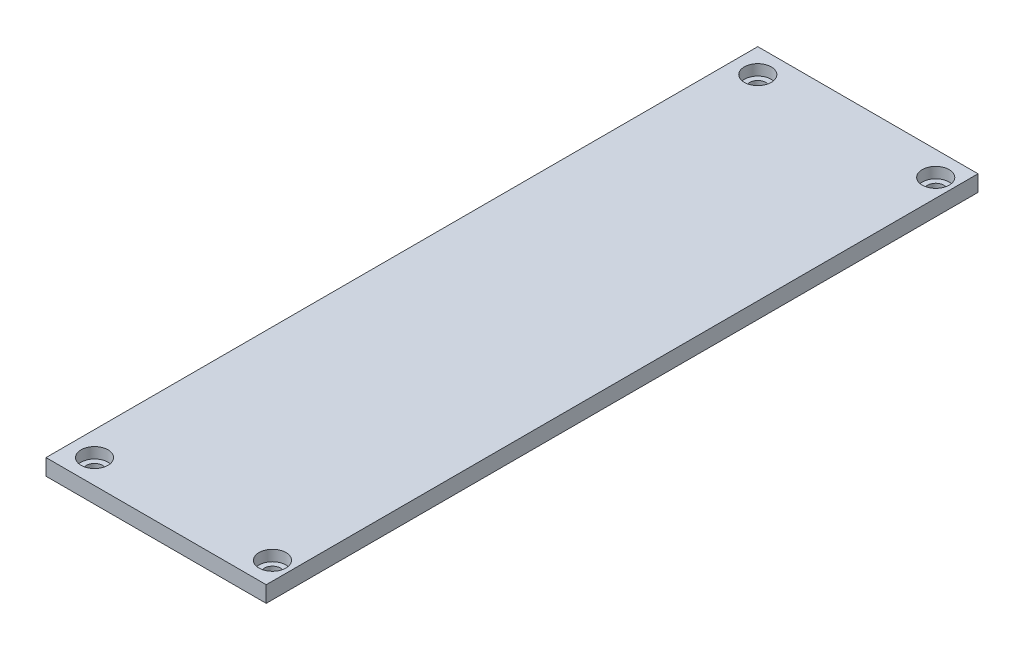
ISO-10303-21;
HEADER;
FILE_DESCRIPTION(('STEP AP214'),'2;1');
FILE_NAME('part.step','',(''),(''),'','','');
FILE_SCHEMA(('AUTOMOTIVE_DESIGN { 1 0 10303 214 1 1 1 1 }'));
ENDSEC;
DATA;
#1=APPLICATION_CONTEXT('core data for automotive mechanical design processes');
#2=APPLICATION_PROTOCOL_DEFINITION('international standard','automotive_design',2000,#1);
#3=PRODUCT_CONTEXT('',#1,'mechanical');
#4=PRODUCT('Part','Part','',(#3));
#5=PRODUCT_RELATED_PRODUCT_CATEGORY('part','',(#4));
#6=PRODUCT_DEFINITION_FORMATION('','',#4);
#7=PRODUCT_DEFINITION_CONTEXT('part definition',#1,'design');
#8=PRODUCT_DEFINITION('design','',#6,#7);
#9=PRODUCT_DEFINITION_SHAPE('','',#8);
#10=(LENGTH_UNIT() NAMED_UNIT(*) SI_UNIT(.MILLI.,.METRE.));
#11=(NAMED_UNIT(*) PLANE_ANGLE_UNIT() SI_UNIT($,.RADIAN.));
#12=(NAMED_UNIT(*) SI_UNIT($,.STERADIAN.) SOLID_ANGLE_UNIT());
#13=UNCERTAINTY_MEASURE_WITH_UNIT(LENGTH_MEASURE(1.E-05),#10,'distance_accuracy_value','');
#14=(GEOMETRIC_REPRESENTATION_CONTEXT(3) GLOBAL_UNCERTAINTY_ASSIGNED_CONTEXT((#13)) GLOBAL_UNIT_ASSIGNED_CONTEXT((#10,
#11,#12)) REPRESENTATION_CONTEXT('',''));
#15=CARTESIAN_POINT('',(0.,0.,0.));
#16=DIRECTION('',(0.,0.,1.));
#17=DIRECTION('',(1.,0.,0.));
#18=AXIS2_PLACEMENT_3D('',#15,#16,#17);
#19=CARTESIAN_POINT('',(-21.,3.,66.));
#20=DIRECTION('',(0.,0.,-1.));
#21=DIRECTION('',(-1.,0.,0.));
#22=AXIS2_PLACEMENT_3D('',#19,#20,#21);
#23=PLANE('',#22);
#24=DIRECTION('',(0.,-1.,0.));
#25=VECTOR('',#24,1.);
#26=CARTESIAN_POINT('',(19.8402403403684,3.,66.));
#27=LINE('',#26,#25);
#28=CARTESIAN_POINT('',(19.8402403403684,3.,66.));
#29=VERTEX_POINT('',#28);
#30=CARTESIAN_POINT('',(19.8402403403684,0.,66.));
#31=VERTEX_POINT('',#30);
#32=EDGE_CURVE('E55',#29,#31,#27,.T.);
#33=ORIENTED_EDGE('',*,*,#32,.F.);
#34=DIRECTION('',(1.,0.,0.));
#35=VECTOR('',#34,1.);
#36=CARTESIAN_POINT('',(-21.,3.,66.));
#37=LINE('',#36,#35);
#38=CARTESIAN_POINT('',(-21.,3.,66.));
#39=VERTEX_POINT('',#38);
#40=EDGE_CURVE('E152',#39,#29,#37,.T.);
#41=ORIENTED_EDGE('',*,*,#40,.F.);
#42=DIRECTION('',(0.,-1.,0.));
#43=VECTOR('',#42,1.);
#44=CARTESIAN_POINT('',(-21.,3.,66.));
#45=LINE('',#44,#43);
#46=CARTESIAN_POINT('',(-21.,0.,66.));
#47=VERTEX_POINT('',#46);
#48=EDGE_CURVE('E153',#39,#47,#45,.T.);
#49=ORIENTED_EDGE('',*,*,#48,.T.);
#50=DIRECTION('',(1.,0.,0.));
#51=VECTOR('',#50,1.);
#52=CARTESIAN_POINT('',(-21.,0.,66.));
#53=LINE('',#52,#51);
#54=EDGE_CURVE('E150',#47,#31,#53,.T.);
#55=ORIENTED_EDGE('',*,*,#54,.T.);
#56=EDGE_LOOP('',(#33,#41,#49,#55));
#57=FACE_BOUND('',#56,.T.);
#58=ADVANCED_FACE('F40',(#57),#23,.F.);
#59=CARTESIAN_POINT('',(0.,3.,0.));
#60=DIRECTION('',(0.,1.,0.));
#61=DIRECTION('',(0.,0.,1.));
#62=AXIS2_PLACEMENT_3D('',#59,#60,#61);
#63=PLANE('',#62);
#64=CARTESIAN_POINT('',(-16.5,3.,61.5));
#65=DIRECTION('',(0.,1.,0.));
#66=DIRECTION('',(0.,0.,1.));
#67=AXIS2_PLACEMENT_3D('',#64,#65,#66);
#68=CIRCLE('',#67,2.5);
#69=CARTESIAN_POINT('',(-16.5,3.,64.));
#70=VERTEX_POINT('',#69);
#71=EDGE_CURVE('E123',#70,#70,#68,.T.);
#72=ORIENTED_EDGE('',*,*,#71,.F.);
#73=EDGE_LOOP('',(#72));
#74=FACE_BOUND('',#73,.T.);
#75=CARTESIAN_POINT('',(16.5,3.,61.5));
#76=DIRECTION('',(0.,1.,0.));
#77=DIRECTION('',(0.,0.,1.));
#78=AXIS2_PLACEMENT_3D('',#75,#76,#77);
#79=CIRCLE('',#78,2.5);
#80=CARTESIAN_POINT('',(16.5,3.,64.));
#81=VERTEX_POINT('',#80);
#82=EDGE_CURVE('E136',#81,#81,#79,.T.);
#83=ORIENTED_EDGE('',*,*,#82,.F.);
#84=EDGE_LOOP('',(#83));
#85=FACE_BOUND('',#84,.T.);
#86=CARTESIAN_POINT('',(16.5,3.,-61.5));
#87=DIRECTION('',(0.,1.,0.));
#88=DIRECTION('',(0.,0.,1.));
#89=AXIS2_PLACEMENT_3D('',#86,#87,#88);
#90=CIRCLE('',#89,2.5);
#91=CARTESIAN_POINT('',(16.5,3.,-59.));
#92=VERTEX_POINT('',#91);
#93=EDGE_CURVE('E130',#92,#92,#90,.T.);
#94=ORIENTED_EDGE('',*,*,#93,.F.);
#95=EDGE_LOOP('',(#94));
#96=FACE_BOUND('',#95,.T.);
#97=CARTESIAN_POINT('',(-16.5,3.,-61.5));
#98=DIRECTION('',(0.,1.,0.));
#99=DIRECTION('',(0.,0.,1.));
#100=AXIS2_PLACEMENT_3D('',#97,#98,#99);
#101=CIRCLE('',#100,2.5);
#102=CARTESIAN_POINT('',(-16.5,3.,-59.));
#103=VERTEX_POINT('',#102);
#104=EDGE_CURVE('E129',#103,#103,#101,.T.);
#105=ORIENTED_EDGE('',*,*,#104,.F.);
#106=EDGE_LOOP('',(#105));
#107=FACE_BOUND('',#106,.T.);
#108=ORIENTED_EDGE('',*,*,#40,.T.);
#109=DIRECTION('',(0.,0.,1.));
#110=VECTOR('',#109,1.);
#111=CARTESIAN_POINT('',(19.8402403403684,3.,-66.));
#112=LINE('',#111,#110);
#113=CARTESIAN_POINT('',(19.8402403403683,3.,-66.));
#114=VERTEX_POINT('',#113);
#115=EDGE_CURVE('E62',#114,#29,#112,.T.);
#116=ORIENTED_EDGE('',*,*,#115,.F.);
#117=DIRECTION('',(-1.,0.,0.));
#118=VECTOR('',#117,1.);
#119=CARTESIAN_POINT('',(-21.,3.,-66.));
#120=LINE('',#119,#118);
#121=CARTESIAN_POINT('',(-21.,3.,-66.));
#122=VERTEX_POINT('',#121);
#123=EDGE_CURVE('E94',#114,#122,#120,.T.);
#124=ORIENTED_EDGE('',*,*,#123,.T.);
#125=DIRECTION('',(0.,0.,1.));
#126=VECTOR('',#125,1.);
#127=CARTESIAN_POINT('',(-21.,3.,-66.));
#128=LINE('',#127,#126);
#129=EDGE_CURVE('E149',#122,#39,#128,.T.);
#130=ORIENTED_EDGE('',*,*,#129,.T.);
#131=EDGE_LOOP('',(#108,#116,#124,#130));
#132=FACE_BOUND('',#131,.T.);
#133=ADVANCED_FACE('F162',(#74,#85,#96,#107,#132),#63,.T.);
#134=CARTESIAN_POINT('',(0.,0.,0.));
#135=DIRECTION('',(0.,1.,0.));
#136=DIRECTION('',(0.,0.,1.));
#137=AXIS2_PLACEMENT_3D('',#134,#135,#136);
#138=PLANE('',#137);
#139=CARTESIAN_POINT('',(-16.5,0.,-61.5));
#140=DIRECTION('',(0.,1.,0.));
#141=DIRECTION('',(0.,0.,1.));
#142=AXIS2_PLACEMENT_3D('',#139,#140,#141);
#143=CIRCLE('',#142,1.5);
#144=CARTESIAN_POINT('',(-16.5,0.,-60.));
#145=VERTEX_POINT('',#144);
#146=EDGE_CURVE('E120',#145,#145,#143,.T.);
#147=ORIENTED_EDGE('',*,*,#146,.T.);
#148=EDGE_LOOP('',(#147));
#149=FACE_BOUND('',#148,.T.);
#150=CARTESIAN_POINT('',(16.5,0.,-61.5));
#151=DIRECTION('',(0.,1.,0.));
#152=DIRECTION('',(0.,0.,1.));
#153=AXIS2_PLACEMENT_3D('',#150,#151,#152);
#154=CIRCLE('',#153,1.5);
#155=CARTESIAN_POINT('',(16.5,0.,-60.));
#156=VERTEX_POINT('',#155);
#157=EDGE_CURVE('E105',#156,#156,#154,.T.);
#158=ORIENTED_EDGE('',*,*,#157,.T.);
#159=EDGE_LOOP('',(#158));
#160=FACE_BOUND('',#159,.T.);
#161=CARTESIAN_POINT('',(16.5,0.,61.5));
#162=DIRECTION('',(0.,1.,0.));
#163=DIRECTION('',(0.,0.,1.));
#164=AXIS2_PLACEMENT_3D('',#161,#162,#163);
#165=CIRCLE('',#164,1.5);
#166=CARTESIAN_POINT('',(16.5,0.,63.));
#167=VERTEX_POINT('',#166);
#168=EDGE_CURVE('E112',#167,#167,#165,.T.);
#169=ORIENTED_EDGE('',*,*,#168,.T.);
#170=EDGE_LOOP('',(#169));
#171=FACE_BOUND('',#170,.T.);
#172=CARTESIAN_POINT('',(-16.5,0.,61.5));
#173=DIRECTION('',(0.,1.,0.));
#174=DIRECTION('',(0.,0.,1.));
#175=AXIS2_PLACEMENT_3D('',#172,#173,#174);
#176=CIRCLE('',#175,1.5);
#177=CARTESIAN_POINT('',(-16.5,0.,63.));
#178=VERTEX_POINT('',#177);
#179=EDGE_CURVE('E101',#178,#178,#176,.T.);
#180=ORIENTED_EDGE('',*,*,#179,.T.);
#181=EDGE_LOOP('',(#180));
#182=FACE_BOUND('',#181,.T.);
#183=DIRECTION('',(0.,0.,-1.));
#184=VECTOR('',#183,1.);
#185=CARTESIAN_POINT('',(19.8402403403684,0.,0.));
#186=LINE('',#185,#184);
#187=CARTESIAN_POINT('',(19.8402403403684,0.,-66.));
#188=VERTEX_POINT('',#187);
#189=EDGE_CURVE('E11',#31,#188,#186,.T.);
#190=ORIENTED_EDGE('',*,*,#189,.F.);
#191=ORIENTED_EDGE('',*,*,#54,.F.);
#192=DIRECTION('',(0.,0.,1.));
#193=VECTOR('',#192,1.);
#194=CARTESIAN_POINT('',(-21.,0.,-66.));
#195=LINE('',#194,#193);
#196=CARTESIAN_POINT('',(-21.,0.,-66.));
#197=VERTEX_POINT('',#196);
#198=EDGE_CURVE('E86',#197,#47,#195,.T.);
#199=ORIENTED_EDGE('',*,*,#198,.F.);
#200=DIRECTION('',(-1.,0.,0.));
#201=VECTOR('',#200,1.);
#202=CARTESIAN_POINT('',(-21.,0.,-66.));
#203=LINE('',#202,#201);
#204=EDGE_CURVE('E82',#188,#197,#203,.T.);
#205=ORIENTED_EDGE('',*,*,#204,.F.);
#206=EDGE_LOOP('',(#190,#191,#199,#205));
#207=FACE_BOUND('',#206,.T.);
#208=ADVANCED_FACE('F84',(#149,#160,#171,#182,#207),#138,.F.);
#209=CARTESIAN_POINT('',(-21.,3.,-66.));
#210=DIRECTION('',(0.,0.,1.));
#211=DIRECTION('',(1.,0.,0.));
#212=AXIS2_PLACEMENT_3D('',#209,#210,#211);
#213=PLANE('',#212);
#214=ORIENTED_EDGE('',*,*,#123,.F.);
#215=DIRECTION('',(0.,-1.,0.));
#216=VECTOR('',#215,1.);
#217=CARTESIAN_POINT('',(19.8402403403684,3.,-66.));
#218=LINE('',#217,#216);
#219=EDGE_CURVE('E93',#114,#188,#218,.T.);
#220=ORIENTED_EDGE('',*,*,#219,.T.);
#221=ORIENTED_EDGE('',*,*,#204,.T.);
#222=DIRECTION('',(0.,-1.,0.));
#223=VECTOR('',#222,1.);
#224=CARTESIAN_POINT('',(-21.,3.,-66.));
#225=LINE('',#224,#223);
#226=EDGE_CURVE('E48',#122,#197,#225,.T.);
#227=ORIENTED_EDGE('',*,*,#226,.F.);
#228=EDGE_LOOP('',(#214,#220,#221,#227));
#229=FACE_BOUND('',#228,.T.);
#230=ADVANCED_FACE('F42',(#229),#213,.F.);
#231=CARTESIAN_POINT('',(-21.,3.,-66.));
#232=DIRECTION('',(1.,0.,0.));
#233=DIRECTION('',(0.,0.,-1.));
#234=AXIS2_PLACEMENT_3D('',#231,#232,#233);
#235=PLANE('',#234);
#236=ORIENTED_EDGE('',*,*,#198,.T.);
#237=ORIENTED_EDGE('',*,*,#48,.F.);
#238=ORIENTED_EDGE('',*,*,#129,.F.);
#239=ORIENTED_EDGE('',*,*,#226,.T.);
#240=EDGE_LOOP('',(#236,#237,#238,#239));
#241=FACE_BOUND('',#240,.T.);
#242=ADVANCED_FACE('F160',(#241),#235,.F.);
#243=CARTESIAN_POINT('',(-16.5,1.,-61.5));
#244=DIRECTION('',(0.,1.,0.));
#245=DIRECTION('',(0.,0.,1.));
#246=AXIS2_PLACEMENT_3D('',#243,#244,#245);
#247=CYLINDRICAL_SURFACE('',#246,2.5);
#248=CARTESIAN_POINT('',(-16.5,1.,-61.5));
#249=DIRECTION('',(0.,1.,0.));
#250=DIRECTION('',(0.,0.,1.));
#251=AXIS2_PLACEMENT_3D('',#248,#249,#250);
#252=CIRCLE('',#251,2.5);
#253=CARTESIAN_POINT('',(-16.5,1.,-59.));
#254=VERTEX_POINT('',#253);
#255=EDGE_CURVE('E90',#254,#254,#252,.T.);
#256=ORIENTED_EDGE('',*,*,#255,.F.);
#257=EDGE_LOOP('',(#256));
#258=FACE_BOUND('',#257,.T.);
#259=ORIENTED_EDGE('',*,*,#104,.T.);
#260=EDGE_LOOP('',(#259));
#261=FACE_BOUND('',#260,.T.);
#262=ADVANCED_FACE('F172',(#258,#261),#247,.F.);
#263=CARTESIAN_POINT('',(-16.5,1.,-61.5));
#264=DIRECTION('',(0.,1.,0.));
#265=DIRECTION('',(0.,0.,1.));
#266=AXIS2_PLACEMENT_3D('',#263,#264,#265);
#267=PLANE('',#266);
#268=CARTESIAN_POINT('',(-16.5,1.,-61.5));
#269=DIRECTION('',(0.,1.,0.));
#270=DIRECTION('',(0.,0.,1.));
#271=AXIS2_PLACEMENT_3D('',#268,#269,#270);
#272=CIRCLE('',#271,1.5);
#273=CARTESIAN_POINT('',(-16.5,1.,-60.));
#274=VERTEX_POINT('',#273);
#275=EDGE_CURVE('E108',#274,#274,#272,.T.);
#276=ORIENTED_EDGE('',*,*,#275,.F.);
#277=EDGE_LOOP('',(#276));
#278=FACE_BOUND('',#277,.T.);
#279=ORIENTED_EDGE('',*,*,#255,.T.);
#280=EDGE_LOOP('',(#279));
#281=FACE_BOUND('',#280,.T.);
#282=ADVANCED_FACE('F177',(#278,#281),#267,.T.);
#283=CARTESIAN_POINT('',(16.5,1.,-61.5));
#284=DIRECTION('',(0.,1.,0.));
#285=DIRECTION('',(0.,0.,1.));
#286=AXIS2_PLACEMENT_3D('',#283,#284,#285);
#287=CYLINDRICAL_SURFACE('',#286,2.5);
#288=CARTESIAN_POINT('',(16.5,1.,-61.5));
#289=DIRECTION('',(0.,1.,0.));
#290=DIRECTION('',(0.,0.,1.));
#291=AXIS2_PLACEMENT_3D('',#288,#289,#290);
#292=CIRCLE('',#291,2.5);
#293=CARTESIAN_POINT('',(16.5,1.,-59.));
#294=VERTEX_POINT('',#293);
#295=EDGE_CURVE('E126',#294,#294,#292,.T.);
#296=ORIENTED_EDGE('',*,*,#295,.F.);
#297=EDGE_LOOP('',(#296));
#298=FACE_BOUND('',#297,.T.);
#299=ORIENTED_EDGE('',*,*,#93,.T.);
#300=EDGE_LOOP('',(#299));
#301=FACE_BOUND('',#300,.T.);
#302=ADVANCED_FACE('F222',(#298,#301),#287,.F.);
#303=CARTESIAN_POINT('',(16.5,1.,-61.5));
#304=DIRECTION('',(0.,1.,0.));
#305=DIRECTION('',(0.,0.,1.));
#306=AXIS2_PLACEMENT_3D('',#303,#304,#305);
#307=PLANE('',#306);
#308=CARTESIAN_POINT('',(16.5,1.,-61.5));
#309=DIRECTION('',(0.,1.,0.));
#310=DIRECTION('',(0.,0.,1.));
#311=AXIS2_PLACEMENT_3D('',#308,#309,#310);
#312=CIRCLE('',#311,1.5);
#313=CARTESIAN_POINT('',(16.5,1.,-60.));
#314=VERTEX_POINT('',#313);
#315=EDGE_CURVE('E109',#314,#314,#312,.T.);
#316=ORIENTED_EDGE('',*,*,#315,.F.);
#317=EDGE_LOOP('',(#316));
#318=FACE_BOUND('',#317,.T.);
#319=ORIENTED_EDGE('',*,*,#295,.T.);
#320=EDGE_LOOP('',(#319));
#321=FACE_BOUND('',#320,.T.);
#322=ADVANCED_FACE('F224',(#318,#321),#307,.T.);
#323=CARTESIAN_POINT('',(16.5,1.,61.5));
#324=DIRECTION('',(0.,1.,0.));
#325=DIRECTION('',(0.,0.,1.));
#326=AXIS2_PLACEMENT_3D('',#323,#324,#325);
#327=CYLINDRICAL_SURFACE('',#326,2.5);
#328=CARTESIAN_POINT('',(16.5,1.,61.5));
#329=DIRECTION('',(0.,1.,0.));
#330=DIRECTION('',(0.,0.,1.));
#331=AXIS2_PLACEMENT_3D('',#328,#329,#330);
#332=CIRCLE('',#331,2.5);
#333=CARTESIAN_POINT('',(16.5,1.,64.));
#334=VERTEX_POINT('',#333);
#335=EDGE_CURVE('E133',#334,#334,#332,.T.);
#336=ORIENTED_EDGE('',*,*,#335,.F.);
#337=EDGE_LOOP('',(#336));
#338=FACE_BOUND('',#337,.T.);
#339=ORIENTED_EDGE('',*,*,#82,.T.);
#340=EDGE_LOOP('',(#339));
#341=FACE_BOUND('',#340,.T.);
#342=ADVANCED_FACE('F231',(#338,#341),#327,.F.);
#343=CARTESIAN_POINT('',(16.5,1.,61.5));
#344=DIRECTION('',(0.,1.,0.));
#345=DIRECTION('',(0.,0.,1.));
#346=AXIS2_PLACEMENT_3D('',#343,#344,#345);
#347=PLANE('',#346);
#348=CARTESIAN_POINT('',(16.5,1.,61.5));
#349=DIRECTION('',(0.,1.,0.));
#350=DIRECTION('',(0.,0.,1.));
#351=AXIS2_PLACEMENT_3D('',#348,#349,#350);
#352=CIRCLE('',#351,1.5);
#353=CARTESIAN_POINT('',(16.5,1.,63.));
#354=VERTEX_POINT('',#353);
#355=EDGE_CURVE('E115',#354,#354,#352,.T.);
#356=ORIENTED_EDGE('',*,*,#355,.F.);
#357=EDGE_LOOP('',(#356));
#358=FACE_BOUND('',#357,.T.);
#359=ORIENTED_EDGE('',*,*,#335,.T.);
#360=EDGE_LOOP('',(#359));
#361=FACE_BOUND('',#360,.T.);
#362=ADVANCED_FACE('F211',(#358,#361),#347,.T.);
#363=CARTESIAN_POINT('',(-16.5,1.,61.5));
#364=DIRECTION('',(0.,1.,0.));
#365=DIRECTION('',(0.,0.,1.));
#366=AXIS2_PLACEMENT_3D('',#363,#364,#365);
#367=CYLINDRICAL_SURFACE('',#366,2.5);
#368=CARTESIAN_POINT('',(-16.5,1.,61.5));
#369=DIRECTION('',(0.,1.,0.));
#370=DIRECTION('',(0.,0.,1.));
#371=AXIS2_PLACEMENT_3D('',#368,#369,#370);
#372=CIRCLE('',#371,2.5);
#373=CARTESIAN_POINT('',(-16.5,1.,64.));
#374=VERTEX_POINT('',#373);
#375=EDGE_CURVE('E139',#374,#374,#372,.T.);
#376=ORIENTED_EDGE('',*,*,#375,.F.);
#377=EDGE_LOOP('',(#376));
#378=FACE_BOUND('',#377,.T.);
#379=ORIENTED_EDGE('',*,*,#71,.T.);
#380=EDGE_LOOP('',(#379));
#381=FACE_BOUND('',#380,.T.);
#382=ADVANCED_FACE('F205',(#378,#381),#367,.F.);
#383=CARTESIAN_POINT('',(-16.5,1.,61.5));
#384=DIRECTION('',(0.,1.,0.));
#385=DIRECTION('',(0.,0.,1.));
#386=AXIS2_PLACEMENT_3D('',#383,#384,#385);
#387=PLANE('',#386);
#388=CARTESIAN_POINT('',(-16.5,1.,61.5));
#389=DIRECTION('',(0.,1.,0.));
#390=DIRECTION('',(0.,0.,1.));
#391=AXIS2_PLACEMENT_3D('',#388,#389,#390);
#392=CIRCLE('',#391,1.5);
#393=CARTESIAN_POINT('',(-16.5,1.,63.));
#394=VERTEX_POINT('',#393);
#395=EDGE_CURVE('E98',#394,#394,#392,.T.);
#396=ORIENTED_EDGE('',*,*,#395,.F.);
#397=EDGE_LOOP('',(#396));
#398=FACE_BOUND('',#397,.T.);
#399=ORIENTED_EDGE('',*,*,#375,.T.);
#400=EDGE_LOOP('',(#399));
#401=FACE_BOUND('',#400,.T.);
#402=ADVANCED_FACE('F201',(#398,#401),#387,.T.);
#403=CARTESIAN_POINT('',(-16.5,0.,-61.5));
#404=DIRECTION('',(0.,1.,0.));
#405=DIRECTION('',(0.,0.,1.));
#406=AXIS2_PLACEMENT_3D('',#403,#404,#405);
#407=CYLINDRICAL_SURFACE('',#406,1.5);
#408=ORIENTED_EDGE('',*,*,#146,.F.);
#409=EDGE_LOOP('',(#408));
#410=FACE_BOUND('',#409,.T.);
#411=ORIENTED_EDGE('',*,*,#275,.T.);
#412=EDGE_LOOP('',(#411));
#413=FACE_BOUND('',#412,.T.);
#414=ADVANCED_FACE('F204',(#410,#413),#407,.F.);
#415=CARTESIAN_POINT('',(16.5,0.,-61.5));
#416=DIRECTION('',(0.,1.,0.));
#417=DIRECTION('',(0.,0.,1.));
#418=AXIS2_PLACEMENT_3D('',#415,#416,#417);
#419=CYLINDRICAL_SURFACE('',#418,1.5);
#420=ORIENTED_EDGE('',*,*,#157,.F.);
#421=EDGE_LOOP('',(#420));
#422=FACE_BOUND('',#421,.T.);
#423=ORIENTED_EDGE('',*,*,#315,.T.);
#424=EDGE_LOOP('',(#423));
#425=FACE_BOUND('',#424,.T.);
#426=ADVANCED_FACE('F270',(#422,#425),#419,.F.);
#427=CARTESIAN_POINT('',(16.5,0.,61.5));
#428=DIRECTION('',(0.,1.,0.));
#429=DIRECTION('',(0.,0.,1.));
#430=AXIS2_PLACEMENT_3D('',#427,#428,#429);
#431=CYLINDRICAL_SURFACE('',#430,1.5);
#432=ORIENTED_EDGE('',*,*,#168,.F.);
#433=EDGE_LOOP('',(#432));
#434=FACE_BOUND('',#433,.T.);
#435=ORIENTED_EDGE('',*,*,#355,.T.);
#436=EDGE_LOOP('',(#435));
#437=FACE_BOUND('',#436,.T.);
#438=ADVANCED_FACE('F197',(#434,#437),#431,.F.);
#439=CARTESIAN_POINT('',(-16.5,0.,61.5));
#440=DIRECTION('',(0.,1.,0.));
#441=DIRECTION('',(0.,0.,1.));
#442=AXIS2_PLACEMENT_3D('',#439,#440,#441);
#443=CYLINDRICAL_SURFACE('',#442,1.5);
#444=ORIENTED_EDGE('',*,*,#179,.F.);
#445=EDGE_LOOP('',(#444));
#446=FACE_BOUND('',#445,.T.);
#447=ORIENTED_EDGE('',*,*,#395,.T.);
#448=EDGE_LOOP('',(#447));
#449=FACE_BOUND('',#448,.T.);
#450=ADVANCED_FACE('F194',(#446,#449),#443,.F.);
#451=CARTESIAN_POINT('',(19.8402403403684,3.,-66.));
#452=DIRECTION('',(1.,0.,0.));
#453=DIRECTION('',(0.,0.,-1.));
#454=AXIS2_PLACEMENT_3D('',#451,#452,#453);
#455=PLANE('',#454);
#456=ORIENTED_EDGE('',*,*,#32,.T.);
#457=ORIENTED_EDGE('',*,*,#189,.T.);
#458=ORIENTED_EDGE('',*,*,#219,.F.);
#459=ORIENTED_EDGE('',*,*,#115,.T.);
#460=EDGE_LOOP('',(#456,#457,#458,#459));
#461=FACE_BOUND('',#460,.T.);
#462=ADVANCED_FACE('F97',(#461),#455,.T.);
#463=CLOSED_SHELL('',(#58,#133,#208,#230,#242,#262,#282,#302,#322,#342,#362,#382,#402,#414,#426,
#438,#450,#462));
#464=MANIFOLD_SOLID_BREP('B2',#463);
#465=ADVANCED_BREP_SHAPE_REPRESENTATION('',(#18,#464),#14);
#466=SHAPE_DEFINITION_REPRESENTATION(#9,#465);
ENDSEC;
END-ISO-10303-21;
